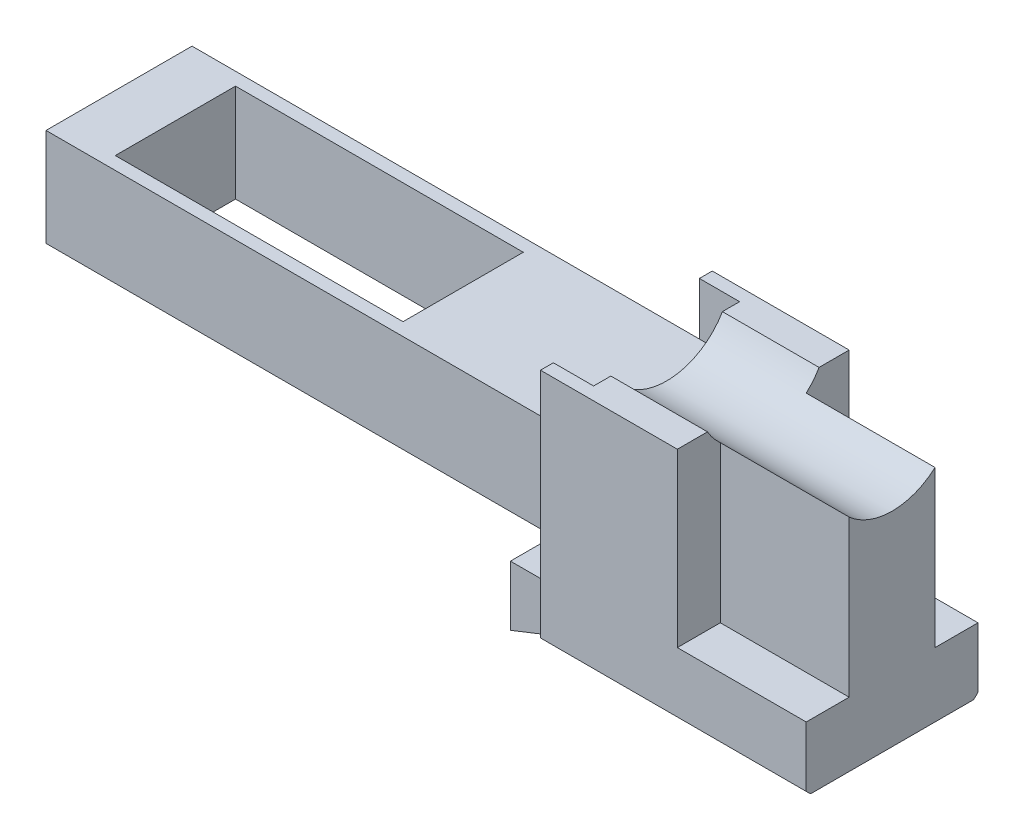
ISO-10303-21;
HEADER;
FILE_DESCRIPTION(('STEP AP214'),'2;1');
FILE_NAME('part.step','',(''),(''),'','','');
FILE_SCHEMA(('AUTOMOTIVE_DESIGN { 1 0 10303 214 1 1 1 1 }'));
ENDSEC;
DATA;
#1=APPLICATION_CONTEXT('core data for automotive mechanical design processes');
#2=APPLICATION_PROTOCOL_DEFINITION('international standard','automotive_design',2000,#1);
#3=PRODUCT_CONTEXT('',#1,'mechanical');
#4=PRODUCT('Part','Part','',(#3));
#5=PRODUCT_RELATED_PRODUCT_CATEGORY('part','',(#4));
#6=PRODUCT_DEFINITION_FORMATION('','',#4);
#7=PRODUCT_DEFINITION_CONTEXT('part definition',#1,'design');
#8=PRODUCT_DEFINITION('design','',#6,#7);
#9=PRODUCT_DEFINITION_SHAPE('','',#8);
#10=(LENGTH_UNIT() NAMED_UNIT(*) SI_UNIT(.MILLI.,.METRE.));
#11=(NAMED_UNIT(*) PLANE_ANGLE_UNIT() SI_UNIT($,.RADIAN.));
#12=(NAMED_UNIT(*) SI_UNIT($,.STERADIAN.) SOLID_ANGLE_UNIT());
#13=UNCERTAINTY_MEASURE_WITH_UNIT(LENGTH_MEASURE(1.E-05),#10,'distance_accuracy_value','');
#14=(GEOMETRIC_REPRESENTATION_CONTEXT(3) GLOBAL_UNCERTAINTY_ASSIGNED_CONTEXT((#13)) GLOBAL_UNIT_ASSIGNED_CONTEXT((#10,
#11,#12)) REPRESENTATION_CONTEXT('',''));
#15=CARTESIAN_POINT('',(0.,0.,0.));
#16=DIRECTION('',(0.,0.,1.));
#17=DIRECTION('',(1.,0.,0.));
#18=AXIS2_PLACEMENT_3D('',#15,#16,#17);
#19=CARTESIAN_POINT('',(0.,0.,-17.));
#20=DIRECTION('',(0.,1.,0.));
#21=DIRECTION('',(0.,0.,1.));
#22=AXIS2_PLACEMENT_3D('',#19,#20,#21);
#23=PLANE('',#22);
#24=DIRECTION('',(1.,0.,0.));
#25=VECTOR('',#24,1.);
#26=CARTESIAN_POINT('',(100.45836543402,0.,12.9903810567666));
#27=LINE('',#26,#25);
#28=CARTESIAN_POINT('',(127.5,0.,12.9903810567666));
#29=VERTEX_POINT('',#28);
#30=CARTESIAN_POINT('',(150.,0.,12.9903810567666));
#31=VERTEX_POINT('',#30);
#32=EDGE_CURVE('E245',#29,#31,#27,.T.);
#33=ORIENTED_EDGE('',*,*,#32,.F.);
#34=DIRECTION('',(0.,0.,1.));
#35=VECTOR('',#34,1.);
#36=CARTESIAN_POINT('',(127.5,0.,-17.));
#37=LINE('',#36,#35);
#38=CARTESIAN_POINT('',(127.5,0.,17.));
#39=VERTEX_POINT('',#38);
#40=EDGE_CURVE('E257',#29,#39,#37,.T.);
#41=ORIENTED_EDGE('',*,*,#40,.T.);
#42=DIRECTION('',(-1.,0.,0.));
#43=VECTOR('',#42,1.);
#44=CARTESIAN_POINT('',(0.,0.,17.));
#45=LINE('',#44,#43);
#46=CARTESIAN_POINT('',(118.13,0.,17.));
#47=VERTEX_POINT('',#46);
#48=EDGE_CURVE('E274',#39,#47,#45,.T.);
#49=ORIENTED_EDGE('',*,*,#48,.T.);
#50=DIRECTION('',(0.,0.,-1.));
#51=VECTOR('',#50,1.);
#52=CARTESIAN_POINT('',(118.13,0.,20.));
#53=LINE('',#52,#51);
#54=CARTESIAN_POINT('',(118.13,0.,20.));
#55=VERTEX_POINT('',#54);
#56=EDGE_CURVE('E293',#55,#47,#53,.T.);
#57=ORIENTED_EDGE('',*,*,#56,.F.);
#58=DIRECTION('',(1.,0.,0.));
#59=VECTOR('',#58,1.);
#60=CARTESIAN_POINT('',(0.,0.,20.));
#61=LINE('',#60,#59);
#62=CARTESIAN_POINT('',(150.,0.,20.));
#63=VERTEX_POINT('',#62);
#64=EDGE_CURVE('E285',#55,#63,#61,.T.);
#65=ORIENTED_EDGE('',*,*,#64,.T.);
#66=DIRECTION('',(0.,0.,1.));
#67=VECTOR('',#66,1.);
#68=CARTESIAN_POINT('',(150.,0.,10.));
#69=LINE('',#68,#67);
#70=EDGE_CURVE('E260',#31,#63,#69,.T.);
#71=ORIENTED_EDGE('',*,*,#70,.F.);
#72=EDGE_LOOP('',(#33,#41,#49,#57,#65,#71));
#73=FACE_BOUND('',#72,.T.);
#74=ADVANCED_FACE('F35',(#73),#23,.T.);
#75=CARTESIAN_POINT('',(0.,-35.,-17.));
#76=DIRECTION('',(0.,-1.,0.));
#77=DIRECTION('',(0.,0.,-1.));
#78=AXIS2_PLACEMENT_3D('',#75,#76,#77);
#79=PLANE('',#78);
#80=DIRECTION('',(1.,0.,0.));
#81=VECTOR('',#80,1.);
#82=CARTESIAN_POINT('',(0.,-35.,17.));
#83=LINE('',#82,#81);
#84=CARTESIAN_POINT('',(0.,-35.,17.));
#85=VERTEX_POINT('',#84);
#86=CARTESIAN_POINT('',(118.13,-35.,17.));
#87=VERTEX_POINT('',#86);
#88=EDGE_CURVE('E320',#85,#87,#83,.T.);
#89=ORIENTED_EDGE('',*,*,#88,.F.);
#90=DIRECTION('',(0.,0.,1.));
#91=VECTOR('',#90,1.);
#92=CARTESIAN_POINT('',(0.,-35.,-17.));
#93=LINE('',#92,#91);
#94=CARTESIAN_POINT('',(0.,-35.,-17.));
#95=VERTEX_POINT('',#94);
#96=EDGE_CURVE('E333',#95,#85,#93,.T.);
#97=ORIENTED_EDGE('',*,*,#96,.F.);
#98=DIRECTION('',(1.,0.,0.));
#99=VECTOR('',#98,1.);
#100=CARTESIAN_POINT('',(0.,-35.,-17.));
#101=LINE('',#100,#99);
#102=CARTESIAN_POINT('',(118.13,-35.,-17.));
#103=VERTEX_POINT('',#102);
#104=EDGE_CURVE('E304',#95,#103,#101,.T.);
#105=ORIENTED_EDGE('',*,*,#104,.T.);
#106=DIRECTION('',(0.,0.,1.));
#107=VECTOR('',#106,1.);
#108=CARTESIAN_POINT('',(118.13,-35.,-17.));
#109=LINE('',#108,#107);
#110=EDGE_CURVE('E319',#103,#87,#109,.T.);
#111=ORIENTED_EDGE('',*,*,#110,.T.);
#112=EDGE_LOOP('',(#89,#97,#105,#111));
#113=FACE_BOUND('',#112,.T.);
#114=DIRECTION('',(0.,0.,1.));
#115=VECTOR('',#114,1.);
#116=CARTESIAN_POINT('',(80.13,-35.,-14.));
#117=LINE('',#116,#115);
#118=CARTESIAN_POINT('',(80.13,-35.,-14.));
#119=VERTEX_POINT('',#118);
#120=CARTESIAN_POINT('',(80.13,-35.,14.));
#121=VERTEX_POINT('',#120);
#122=EDGE_CURVE('E713',#119,#121,#117,.T.);
#123=ORIENTED_EDGE('',*,*,#122,.F.);
#124=DIRECTION('',(1.,0.,0.));
#125=VECTOR('',#124,1.);
#126=CARTESIAN_POINT('',(0.,-35.,-14.));
#127=LINE('',#126,#125);
#128=CARTESIAN_POINT('',(13.13,-35.,-14.));
#129=VERTEX_POINT('',#128);
#130=EDGE_CURVE('E700',#129,#119,#127,.T.);
#131=ORIENTED_EDGE('',*,*,#130,.F.);
#132=DIRECTION('',(0.,0.,1.));
#133=VECTOR('',#132,1.);
#134=CARTESIAN_POINT('',(13.13,-35.,-14.));
#135=LINE('',#134,#133);
#136=CARTESIAN_POINT('',(13.13,-35.,14.));
#137=VERTEX_POINT('',#136);
#138=EDGE_CURVE('E403',#129,#137,#135,.T.);
#139=ORIENTED_EDGE('',*,*,#138,.T.);
#140=DIRECTION('',(1.,0.,0.));
#141=VECTOR('',#140,1.);
#142=CARTESIAN_POINT('',(0.,-35.,14.));
#143=LINE('',#142,#141);
#144=EDGE_CURVE('E695',#137,#121,#143,.T.);
#145=ORIENTED_EDGE('',*,*,#144,.T.);
#146=EDGE_LOOP('',(#123,#131,#139,#145));
#147=FACE_BOUND('',#146,.T.);
#148=ADVANCED_FACE('F475',(#113,#147),#79,.T.);
#149=CARTESIAN_POINT('',(0.,-12.22,-17.));
#150=DIRECTION('',(0.,-1.,0.));
#151=DIRECTION('',(0.,0.,-1.));
#152=AXIS2_PLACEMENT_3D('',#149,#150,#151);
#153=PLANE('',#152);
#154=DIRECTION('',(1.,0.,0.));
#155=VECTOR('',#154,1.);
#156=CARTESIAN_POINT('',(0.,-12.22,17.));
#157=LINE('',#156,#155);
#158=CARTESIAN_POINT('',(0.,-12.22,17.));
#159=VERTEX_POINT('',#158);
#160=CARTESIAN_POINT('',(118.13,-12.22,17.));
#161=VERTEX_POINT('',#160);
#162=EDGE_CURVE('E446',#159,#161,#157,.T.);
#163=ORIENTED_EDGE('',*,*,#162,.T.);
#164=CARTESIAN_POINT('',(127.5,-12.22,17.));
#165=VERTEX_POINT('',#164);
#166=EDGE_CURVE('E437',#161,#165,#157,.T.);
#167=ORIENTED_EDGE('',*,*,#166,.T.);
#168=DIRECTION('',(0.,0.,1.));
#169=VECTOR('',#168,1.);
#170=CARTESIAN_POINT('',(127.5,-12.22,-17.));
#171=LINE('',#170,#169);
#172=CARTESIAN_POINT('',(127.5,-12.22,-17.));
#173=VERTEX_POINT('',#172);
#174=EDGE_CURVE('E268',#173,#165,#171,.T.);
#175=ORIENTED_EDGE('',*,*,#174,.F.);
#176=DIRECTION('',(1.,0.,0.));
#177=VECTOR('',#176,1.);
#178=CARTESIAN_POINT('',(0.,-12.22,-17.));
#179=LINE('',#178,#177);
#180=CARTESIAN_POINT('',(118.13,-12.22,-17.));
#181=VERTEX_POINT('',#180);
#182=EDGE_CURVE('E442',#181,#173,#179,.T.);
#183=ORIENTED_EDGE('',*,*,#182,.F.);
#184=CARTESIAN_POINT('',(0.,-12.22,-17.));
#185=VERTEX_POINT('',#184);
#186=EDGE_CURVE('E438',#185,#181,#179,.T.);
#187=ORIENTED_EDGE('',*,*,#186,.F.);
#188=DIRECTION('',(0.,0.,1.));
#189=VECTOR('',#188,1.);
#190=CARTESIAN_POINT('',(0.,-12.22,-17.));
#191=LINE('',#190,#189);
#192=EDGE_CURVE('E271',#185,#159,#191,.T.);
#193=ORIENTED_EDGE('',*,*,#192,.T.);
#194=EDGE_LOOP('',(#163,#167,#175,#183,#187,#193));
#195=FACE_BOUND('',#194,.T.);
#196=DIRECTION('',(1.,0.,0.));
#197=VECTOR('',#196,1.);
#198=CARTESIAN_POINT('',(0.,-12.22,-14.));
#199=LINE('',#198,#197);
#200=CARTESIAN_POINT('',(13.13,-12.22,-14.));
#201=VERTEX_POINT('',#200);
#202=CARTESIAN_POINT('',(80.13,-12.22,-14.));
#203=VERTEX_POINT('',#202);
#204=EDGE_CURVE('E707',#201,#203,#199,.T.);
#205=ORIENTED_EDGE('',*,*,#204,.T.);
#206=DIRECTION('',(0.,0.,1.));
#207=VECTOR('',#206,1.);
#208=CARTESIAN_POINT('',(80.13,-12.22,-14.));
#209=LINE('',#208,#207);
#210=CARTESIAN_POINT('',(80.13,-12.22,14.));
#211=VERTEX_POINT('',#210);
#212=EDGE_CURVE('E725',#203,#211,#209,.T.);
#213=ORIENTED_EDGE('',*,*,#212,.T.);
#214=DIRECTION('',(1.,0.,0.));
#215=VECTOR('',#214,1.);
#216=CARTESIAN_POINT('',(0.,-12.22,14.));
#217=LINE('',#216,#215);
#218=CARTESIAN_POINT('',(13.13,-12.22,14.));
#219=VERTEX_POINT('',#218);
#220=EDGE_CURVE('E719',#219,#211,#217,.T.);
#221=ORIENTED_EDGE('',*,*,#220,.F.);
#222=DIRECTION('',(0.,0.,1.));
#223=VECTOR('',#222,1.);
#224=CARTESIAN_POINT('',(13.13,-12.22,-14.));
#225=LINE('',#224,#223);
#226=EDGE_CURVE('E408',#201,#219,#225,.T.);
#227=ORIENTED_EDGE('',*,*,#226,.F.);
#228=EDGE_LOOP('',(#205,#213,#221,#227));
#229=FACE_BOUND('',#228,.T.);
#230=ADVANCED_FACE('F455',(#195,#229),#153,.F.);
#231=DIRECTION('',(1.,0.,0.));
#232=VECTOR('',#231,1.);
#233=CARTESIAN_POINT('',(100.45836543402,0.,-12.9903810567666));
#234=LINE('',#233,#232);
#235=CARTESIAN_POINT('',(127.5,0.,-12.9903810567666));
#236=VERTEX_POINT('',#235);
#237=CARTESIAN_POINT('',(150.,0.,-12.9903810567666));
#238=VERTEX_POINT('',#237);
#239=EDGE_CURVE('E248',#236,#238,#234,.T.);
#240=ORIENTED_EDGE('',*,*,#239,.T.);
#241=DIRECTION('',(0.,0.,-1.));
#242=VECTOR('',#241,1.);
#243=CARTESIAN_POINT('',(150.,0.,-10.));
#244=LINE('',#243,#242);
#245=CARTESIAN_POINT('',(150.,0.,-20.));
#246=VERTEX_POINT('',#245);
#247=EDGE_CURVE('E414',#238,#246,#244,.T.);
#248=ORIENTED_EDGE('',*,*,#247,.T.);
#249=DIRECTION('',(1.,0.,0.));
#250=VECTOR('',#249,1.);
#251=CARTESIAN_POINT('',(0.,0.,-20.));
#252=LINE('',#251,#250);
#253=CARTESIAN_POINT('',(118.13,0.,-20.));
#254=VERTEX_POINT('',#253);
#255=EDGE_CURVE('E282',#254,#246,#252,.T.);
#256=ORIENTED_EDGE('',*,*,#255,.F.);
#257=CARTESIAN_POINT('',(118.13,0.,-17.));
#258=VERTEX_POINT('',#257);
#259=EDGE_CURVE('E287',#258,#254,#53,.T.);
#260=ORIENTED_EDGE('',*,*,#259,.F.);
#261=DIRECTION('',(-1.,0.,0.));
#262=VECTOR('',#261,1.);
#263=CARTESIAN_POINT('',(0.,0.,-17.));
#264=LINE('',#263,#262);
#265=CARTESIAN_POINT('',(127.5,0.,-17.));
#266=VERTEX_POINT('',#265);
#267=EDGE_CURVE('E278',#266,#258,#264,.T.);
#268=ORIENTED_EDGE('',*,*,#267,.F.);
#269=EDGE_CURVE('E267',#266,#236,#37,.T.);
#270=ORIENTED_EDGE('',*,*,#269,.T.);
#271=EDGE_LOOP('',(#240,#248,#256,#260,#268,#270));
#272=FACE_BOUND('',#271,.T.);
#273=ADVANCED_FACE('F459',(#272),#23,.T.);
#274=CARTESIAN_POINT('',(0.,0.,-17.));
#275=DIRECTION('',(0.,0.,1.));
#276=DIRECTION('',(1.,0.,0.));
#277=AXIS2_PLACEMENT_3D('',#274,#275,#276);
#278=PLANE('',#277);
#279=DIRECTION('',(0.,-1.,0.));
#280=VECTOR('',#279,1.);
#281=CARTESIAN_POINT('',(0.,0.,-17.));
#282=LINE('',#281,#280);
#283=EDGE_CURVE('E317',#185,#95,#282,.T.);
#284=ORIENTED_EDGE('',*,*,#283,.F.);
#285=ORIENTED_EDGE('',*,*,#186,.T.);
#286=DIRECTION('',(0.,-1.,0.));
#287=VECTOR('',#286,1.);
#288=CARTESIAN_POINT('',(118.13,0.,-17.));
#289=LINE('',#288,#287);
#290=EDGE_CURVE('E302',#181,#103,#289,.T.);
#291=ORIENTED_EDGE('',*,*,#290,.T.);
#292=ORIENTED_EDGE('',*,*,#104,.F.);
#293=EDGE_LOOP('',(#284,#285,#291,#292));
#294=FACE_BOUND('',#293,.T.);
#295=ADVANCED_FACE('F469',(#294),#278,.F.);
#296=CARTESIAN_POINT('',(0.,0.,17.));
#297=DIRECTION('',(0.,0.,1.));
#298=DIRECTION('',(1.,0.,0.));
#299=AXIS2_PLACEMENT_3D('',#296,#297,#298);
#300=PLANE('',#299);
#301=ORIENTED_EDGE('',*,*,#162,.F.);
#302=DIRECTION('',(0.,-1.,0.));
#303=VECTOR('',#302,1.);
#304=CARTESIAN_POINT('',(0.,0.,17.));
#305=LINE('',#304,#303);
#306=EDGE_CURVE('E308',#159,#85,#305,.T.);
#307=ORIENTED_EDGE('',*,*,#306,.T.);
#308=ORIENTED_EDGE('',*,*,#88,.T.);
#309=DIRECTION('',(0.,-1.,0.));
#310=VECTOR('',#309,1.);
#311=CARTESIAN_POINT('',(118.13,0.,17.));
#312=LINE('',#311,#310);
#313=EDGE_CURVE('E354',#161,#87,#312,.T.);
#314=ORIENTED_EDGE('',*,*,#313,.F.);
#315=EDGE_LOOP('',(#301,#307,#308,#314));
#316=FACE_BOUND('',#315,.T.);
#317=ADVANCED_FACE('F483',(#316),#300,.T.);
#318=CARTESIAN_POINT('',(0.,0.,-17.));
#319=DIRECTION('',(-1.,0.,0.));
#320=DIRECTION('',(0.,0.,1.));
#321=AXIS2_PLACEMENT_3D('',#318,#319,#320);
#322=PLANE('',#321);
#323=ORIENTED_EDGE('',*,*,#192,.F.);
#324=ORIENTED_EDGE('',*,*,#283,.T.);
#325=ORIENTED_EDGE('',*,*,#96,.T.);
#326=ORIENTED_EDGE('',*,*,#306,.F.);
#327=EDGE_LOOP('',(#323,#324,#325,#326));
#328=FACE_BOUND('',#327,.T.);
#329=ADVANCED_FACE('F480',(#328),#322,.T.);
#330=CARTESIAN_POINT('',(180.,0.,-17.));
#331=DIRECTION('',(-1.,0.,0.));
#332=DIRECTION('',(0.,0.,1.));
#333=AXIS2_PLACEMENT_3D('',#330,#331,#332);
#334=PLANE('',#333);
#335=DIRECTION('',(0.,-1.,0.));
#336=VECTOR('',#335,1.);
#337=CARTESIAN_POINT('',(180.,0.,20.));
#338=LINE('',#337,#336);
#339=CARTESIAN_POINT('',(180.,-40.,20.));
#340=VERTEX_POINT('',#339);
#341=CARTESIAN_POINT('',(180.,-54.,20.));
#342=VERTEX_POINT('',#341);
#343=EDGE_CURVE('E281',#340,#342,#338,.T.);
#344=ORIENTED_EDGE('',*,*,#343,.T.);
#345=DIRECTION('',(0.,0.707106781186549,0.707106781186546));
#346=VECTOR('',#345,1.);
#347=CARTESIAN_POINT('',(180.,-54.,20.));
#348=LINE('',#347,#346);
#349=CARTESIAN_POINT('',(180.,-55.,19.));
#350=VERTEX_POINT('',#349);
#351=EDGE_CURVE('E363',#342,#350,#348,.F.);
#352=ORIENTED_EDGE('',*,*,#351,.T.);
#353=DIRECTION('',(0.,0.,1.));
#354=VECTOR('',#353,1.);
#355=CARTESIAN_POINT('',(180.,-55.,-17.));
#356=LINE('',#355,#354);
#357=CARTESIAN_POINT('',(180.,-55.,-19.));
#358=VERTEX_POINT('',#357);
#359=EDGE_CURVE('E337',#358,#350,#356,.T.);
#360=ORIENTED_EDGE('',*,*,#359,.F.);
#361=DIRECTION('',(0.,0.707106781186548,-0.707106781186548));
#362=VECTOR('',#361,1.);
#363=CARTESIAN_POINT('',(180.,-55.,-19.));
#364=LINE('',#363,#362);
#365=CARTESIAN_POINT('',(180.,-54.,-20.));
#366=VERTEX_POINT('',#365);
#367=EDGE_CURVE('E361',#358,#366,#364,.T.);
#368=ORIENTED_EDGE('',*,*,#367,.T.);
#369=DIRECTION('',(0.,-1.,0.));
#370=VECTOR('',#369,1.);
#371=CARTESIAN_POINT('',(180.,0.,-20.));
#372=LINE('',#371,#370);
#373=CARTESIAN_POINT('',(180.,-40.,-20.));
#374=VERTEX_POINT('',#373);
#375=EDGE_CURVE('E289',#374,#366,#372,.T.);
#376=ORIENTED_EDGE('',*,*,#375,.F.);
#377=DIRECTION('',(0.,0.,-1.));
#378=VECTOR('',#377,1.);
#379=CARTESIAN_POINT('',(180.,-40.,-10.));
#380=LINE('',#379,#378);
#381=CARTESIAN_POINT('',(180.,-40.,-10.));
#382=VERTEX_POINT('',#381);
#383=EDGE_CURVE('E419',#382,#374,#380,.T.);
#384=ORIENTED_EDGE('',*,*,#383,.F.);
#385=DIRECTION('',(0.,-1.,0.));
#386=VECTOR('',#385,1.);
#387=CARTESIAN_POINT('',(180.,0.,-10.));
#388=LINE('',#387,#386);
#389=CARTESIAN_POINT('',(180.,-3.68033988749895,-10.));
#390=VERTEX_POINT('',#389);
#391=EDGE_CURVE('E405',#390,#382,#388,.T.);
#392=ORIENTED_EDGE('',*,*,#391,.F.);
#393=CARTESIAN_POINT('',(180.,7.5,0.));
#394=DIRECTION('',(1.,0.,0.));
#395=DIRECTION('',(0.,0.,1.));
#396=AXIS2_PLACEMENT_3D('',#393,#394,#395);
#397=CIRCLE('',#396,15.);
#398=CARTESIAN_POINT('',(180.,-3.68033988749895,10.));
#399=VERTEX_POINT('',#398);
#400=EDGE_CURVE('E664',#399,#390,#397,.T.);
#401=ORIENTED_EDGE('',*,*,#400,.F.);
#402=DIRECTION('',(0.,-1.,0.));
#403=VECTOR('',#402,1.);
#404=CARTESIAN_POINT('',(180.,0.,10.));
#405=LINE('',#404,#403);
#406=CARTESIAN_POINT('',(180.,-40.,10.));
#407=VERTEX_POINT('',#406);
#408=EDGE_CURVE('E421',#399,#407,#405,.T.);
#409=ORIENTED_EDGE('',*,*,#408,.T.);
#410=DIRECTION('',(0.,0.,1.));
#411=VECTOR('',#410,1.);
#412=CARTESIAN_POINT('',(180.,-40.,10.));
#413=LINE('',#412,#411);
#414=EDGE_CURVE('E435',#407,#340,#413,.T.);
#415=ORIENTED_EDGE('',*,*,#414,.T.);
#416=EDGE_LOOP('',(#344,#352,#360,#368,#376,#384,#392,#401,#409,#415));
#417=FACE_BOUND('',#416,.T.);
#418=ADVANCED_FACE('F386',(#417),#334,.F.);
#419=CARTESIAN_POINT('',(0.,-55.,-17.));
#420=DIRECTION('',(0.,-1.,0.));
#421=DIRECTION('',(0.,0.,-1.));
#422=AXIS2_PLACEMENT_3D('',#419,#420,#421);
#423=PLANE('',#422);
#424=ORIENTED_EDGE('',*,*,#359,.T.);
#425=DIRECTION('',(-1.,0.,0.));
#426=VECTOR('',#425,1.);
#427=CARTESIAN_POINT('',(0.,-55.,19.));
#428=LINE('',#427,#426);
#429=CARTESIAN_POINT('',(118.13,-55.,19.));
#430=VERTEX_POINT('',#429);
#431=EDGE_CURVE('E368',#350,#430,#428,.T.);
#432=ORIENTED_EDGE('',*,*,#431,.T.);
#433=DIRECTION('',(0.,0.,-1.));
#434=VECTOR('',#433,1.);
#435=CARTESIAN_POINT('',(118.13,-55.,20.));
#436=LINE('',#435,#434);
#437=CARTESIAN_POINT('',(118.13,-55.,17.));
#438=VERTEX_POINT('',#437);
#439=EDGE_CURVE('E297',#430,#438,#436,.T.);
#440=ORIENTED_EDGE('',*,*,#439,.T.);
#441=DIRECTION('',(0.,0.,1.));
#442=VECTOR('',#441,1.);
#443=CARTESIAN_POINT('',(118.13,-55.,-17.));
#444=LINE('',#443,#442);
#445=CARTESIAN_POINT('',(118.13,-55.,-17.));
#446=VERTEX_POINT('',#445);
#447=EDGE_CURVE('E340',#446,#438,#444,.T.);
#448=ORIENTED_EDGE('',*,*,#447,.F.);
#449=CARTESIAN_POINT('',(118.13,-55.,-19.));
#450=VERTEX_POINT('',#449);
#451=EDGE_CURVE('E296',#446,#450,#436,.T.);
#452=ORIENTED_EDGE('',*,*,#451,.T.);
#453=DIRECTION('',(1.,0.,0.));
#454=VECTOR('',#453,1.);
#455=CARTESIAN_POINT('',(180.,-55.,-19.));
#456=LINE('',#455,#454);
#457=EDGE_CURVE('E365',#450,#358,#456,.T.);
#458=ORIENTED_EDGE('',*,*,#457,.T.);
#459=EDGE_LOOP('',(#424,#432,#440,#448,#452,#458));
#460=FACE_BOUND('',#459,.T.);
#461=ADVANCED_FACE('F389',(#460),#423,.T.);
#462=CARTESIAN_POINT('',(34.7364747734694,-87.9404424644796,-17.));
#463=DIRECTION('',(0.367378285083804,-0.9300716078071,0.));
#464=DIRECTION('',(0.9300716078071,0.367378285083804,0.));
#465=AXIS2_PLACEMENT_3D('',#462,#463,#464);
#466=PLANE('',#465);
#467=DIRECTION('',(0.9300716078071,0.367378285083804,0.));
#468=VECTOR('',#467,1.);
#469=CARTESIAN_POINT('',(34.7364747734694,-87.9404424644796,17.));
#470=LINE('',#469,#468);
#471=CARTESIAN_POINT('',(108.13,-58.95,17.));
#472=VERTEX_POINT('',#471);
#473=EDGE_CURVE('E329',#472,#438,#470,.T.);
#474=ORIENTED_EDGE('',*,*,#473,.F.);
#475=DIRECTION('',(0.,0.,1.));
#476=VECTOR('',#475,1.);
#477=CARTESIAN_POINT('',(108.13,-58.95,-17.));
#478=LINE('',#477,#476);
#479=CARTESIAN_POINT('',(108.13,-58.95,-17.));
#480=VERTEX_POINT('',#479);
#481=EDGE_CURVE('E343',#480,#472,#478,.T.);
#482=ORIENTED_EDGE('',*,*,#481,.F.);
#483=DIRECTION('',(0.9300716078071,0.367378285083804,0.));
#484=VECTOR('',#483,1.);
#485=CARTESIAN_POINT('',(34.7364747734694,-87.9404424644796,-17.));
#486=LINE('',#485,#484);
#487=EDGE_CURVE('E314',#480,#446,#486,.T.);
#488=ORIENTED_EDGE('',*,*,#487,.T.);
#489=ORIENTED_EDGE('',*,*,#447,.T.);
#490=EDGE_LOOP('',(#474,#482,#488,#489));
#491=FACE_BOUND('',#490,.T.);
#492=ADVANCED_FACE('F572',(#491),#466,.T.);
#493=CARTESIAN_POINT('',(108.13,0.,-17.));
#494=DIRECTION('',(-1.,0.,0.));
#495=DIRECTION('',(0.,0.,1.));
#496=AXIS2_PLACEMENT_3D('',#493,#494,#495);
#497=PLANE('',#496);
#498=DIRECTION('',(0.,-1.,0.));
#499=VECTOR('',#498,1.);
#500=CARTESIAN_POINT('',(108.13,0.,17.));
#501=LINE('',#500,#499);
#502=CARTESIAN_POINT('',(108.13,-45.,17.));
#503=VERTEX_POINT('',#502);
#504=EDGE_CURVE('E326',#503,#472,#501,.T.);
#505=ORIENTED_EDGE('',*,*,#504,.F.);
#506=DIRECTION('',(0.,0.,1.));
#507=VECTOR('',#506,1.);
#508=CARTESIAN_POINT('',(108.13,-45.,-17.));
#509=LINE('',#508,#507);
#510=CARTESIAN_POINT('',(108.13,-45.,-17.));
#511=VERTEX_POINT('',#510);
#512=EDGE_CURVE('E345',#511,#503,#509,.T.);
#513=ORIENTED_EDGE('',*,*,#512,.F.);
#514=DIRECTION('',(0.,-1.,0.));
#515=VECTOR('',#514,1.);
#516=CARTESIAN_POINT('',(108.13,0.,-17.));
#517=LINE('',#516,#515);
#518=EDGE_CURVE('E311',#511,#480,#517,.T.);
#519=ORIENTED_EDGE('',*,*,#518,.T.);
#520=ORIENTED_EDGE('',*,*,#481,.T.);
#521=EDGE_LOOP('',(#505,#513,#519,#520));
#522=FACE_BOUND('',#521,.T.);
#523=ADVANCED_FACE('F563',(#522),#497,.T.);
#524=CARTESIAN_POINT('',(0.,-45.,-17.));
#525=DIRECTION('',(0.,-1.,0.));
#526=DIRECTION('',(0.,0.,-1.));
#527=AXIS2_PLACEMENT_3D('',#524,#525,#526);
#528=PLANE('',#527);
#529=DIRECTION('',(1.,0.,0.));
#530=VECTOR('',#529,1.);
#531=CARTESIAN_POINT('',(0.,-45.,17.));
#532=LINE('',#531,#530);
#533=CARTESIAN_POINT('',(118.13,-45.,17.));
#534=VERTEX_POINT('',#533);
#535=EDGE_CURVE('E323',#503,#534,#532,.T.);
#536=ORIENTED_EDGE('',*,*,#535,.T.);
#537=DIRECTION('',(0.,0.,1.));
#538=VECTOR('',#537,1.);
#539=CARTESIAN_POINT('',(118.13,-45.,-17.));
#540=LINE('',#539,#538);
#541=CARTESIAN_POINT('',(118.13,-45.,-17.));
#542=VERTEX_POINT('',#541);
#543=EDGE_CURVE('E347',#542,#534,#540,.T.);
#544=ORIENTED_EDGE('',*,*,#543,.F.);
#545=DIRECTION('',(1.,0.,0.));
#546=VECTOR('',#545,1.);
#547=CARTESIAN_POINT('',(0.,-45.,-17.));
#548=LINE('',#547,#546);
#549=EDGE_CURVE('E307',#511,#542,#548,.T.);
#550=ORIENTED_EDGE('',*,*,#549,.F.);
#551=ORIENTED_EDGE('',*,*,#512,.T.);
#552=EDGE_LOOP('',(#536,#544,#550,#551));
#553=FACE_BOUND('',#552,.T.);
#554=ADVANCED_FACE('F558',(#553),#528,.F.);
#555=CARTESIAN_POINT('',(118.13,0.,-17.));
#556=DIRECTION('',(1.,0.,0.));
#557=DIRECTION('',(0.,0.,-1.));
#558=AXIS2_PLACEMENT_3D('',#555,#556,#557);
#559=PLANE('',#558);
#560=ORIENTED_EDGE('',*,*,#439,.F.);
#561=DIRECTION('',(0.,-0.707106781186549,-0.707106781186546));
#562=VECTOR('',#561,1.);
#563=CARTESIAN_POINT('',(118.13,-54.,20.));
#564=LINE('',#563,#562);
#565=CARTESIAN_POINT('',(118.13,-54.,20.));
#566=VERTEX_POINT('',#565);
#567=EDGE_CURVE('E43',#430,#566,#564,.F.);
#568=ORIENTED_EDGE('',*,*,#567,.T.);
#569=DIRECTION('',(0.,1.,0.));
#570=VECTOR('',#569,1.);
#571=CARTESIAN_POINT('',(118.13,0.,20.));
#572=LINE('',#571,#570);
#573=EDGE_CURVE('E279',#566,#55,#572,.T.);
#574=ORIENTED_EDGE('',*,*,#573,.T.);
#575=ORIENTED_EDGE('',*,*,#56,.T.);
#576=EDGE_CURVE('E355',#47,#161,#312,.T.);
#577=ORIENTED_EDGE('',*,*,#576,.T.);
#578=ORIENTED_EDGE('',*,*,#313,.T.);
#579=ORIENTED_EDGE('',*,*,#110,.F.);
#580=ORIENTED_EDGE('',*,*,#290,.F.);
#581=EDGE_CURVE('E303',#258,#181,#289,.T.);
#582=ORIENTED_EDGE('',*,*,#581,.F.);
#583=ORIENTED_EDGE('',*,*,#259,.T.);
#584=DIRECTION('',(0.,1.,0.));
#585=VECTOR('',#584,1.);
#586=CARTESIAN_POINT('',(118.13,0.,-20.));
#587=LINE('',#586,#585);
#588=CARTESIAN_POINT('',(118.13,-54.,-20.));
#589=VERTEX_POINT('',#588);
#590=EDGE_CURVE('E270',#589,#254,#587,.T.);
#591=ORIENTED_EDGE('',*,*,#590,.F.);
#592=DIRECTION('',(0.,-0.707106781186548,0.707106781186548));
#593=VECTOR('',#592,1.);
#594=CARTESIAN_POINT('',(118.13,-55.,-19.));
#595=LINE('',#594,#593);
#596=EDGE_CURVE('E55',#589,#450,#595,.T.);
#597=ORIENTED_EDGE('',*,*,#596,.T.);
#598=ORIENTED_EDGE('',*,*,#451,.F.);
#599=EDGE_CURVE('E299',#542,#446,#289,.T.);
#600=ORIENTED_EDGE('',*,*,#599,.F.);
#601=ORIENTED_EDGE('',*,*,#543,.T.);
#602=EDGE_CURVE('E336',#534,#438,#312,.T.);
#603=ORIENTED_EDGE('',*,*,#602,.T.);
#604=EDGE_LOOP('',(#560,#568,#574,#575,#577,#578,#579,#580,#582,#583,#591,#597,#598,#600,#601,#603));
#605=FACE_BOUND('',#604,.T.);
#606=ADVANCED_FACE('F373',(#605),#559,.F.);
#607=ORIENTED_EDGE('',*,*,#549,.T.);
#608=ORIENTED_EDGE('',*,*,#599,.T.);
#609=ORIENTED_EDGE('',*,*,#487,.F.);
#610=ORIENTED_EDGE('',*,*,#518,.F.);
#611=EDGE_LOOP('',(#607,#608,#609,#610));
#612=FACE_BOUND('',#611,.T.);
#613=ADVANCED_FACE('F509',(#612),#278,.F.);
#614=ORIENTED_EDGE('',*,*,#602,.F.);
#615=ORIENTED_EDGE('',*,*,#535,.F.);
#616=ORIENTED_EDGE('',*,*,#504,.T.);
#617=ORIENTED_EDGE('',*,*,#473,.T.);
#618=EDGE_LOOP('',(#614,#615,#616,#617));
#619=FACE_BOUND('',#618,.T.);
#620=ADVANCED_FACE('F516',(#619),#300,.T.);
#621=CARTESIAN_POINT('',(0.,0.,20.));
#622=DIRECTION('',(0.,0.,1.));
#623=DIRECTION('',(1.,0.,0.));
#624=AXIS2_PLACEMENT_3D('',#621,#622,#623);
#625=PLANE('',#624);
#626=ORIENTED_EDGE('',*,*,#573,.F.);
#627=DIRECTION('',(1.,0.,0.));
#628=VECTOR('',#627,1.);
#629=CARTESIAN_POINT('',(0.,-54.,20.));
#630=LINE('',#629,#628);
#631=EDGE_CURVE('E358',#566,#342,#630,.T.);
#632=ORIENTED_EDGE('',*,*,#631,.T.);
#633=ORIENTED_EDGE('',*,*,#343,.F.);
#634=DIRECTION('',(1.,0.,0.));
#635=VECTOR('',#634,1.);
#636=CARTESIAN_POINT('',(150.,-40.,20.));
#637=LINE('',#636,#635);
#638=CARTESIAN_POINT('',(150.,-40.,20.));
#639=VERTEX_POINT('',#638);
#640=EDGE_CURVE('E416',#639,#340,#637,.T.);
#641=ORIENTED_EDGE('',*,*,#640,.F.);
#642=DIRECTION('',(0.,-1.,0.));
#643=VECTOR('',#642,1.);
#644=CARTESIAN_POINT('',(150.,0.,20.));
#645=LINE('',#644,#643);
#646=EDGE_CURVE('E424',#63,#639,#645,.T.);
#647=ORIENTED_EDGE('',*,*,#646,.F.);
#648=ORIENTED_EDGE('',*,*,#64,.F.);
#649=EDGE_LOOP('',(#626,#632,#633,#641,#647,#648));
#650=FACE_BOUND('',#649,.T.);
#651=ADVANCED_FACE('F380',(#650),#625,.T.);
#652=CARTESIAN_POINT('',(0.,0.,-20.));
#653=DIRECTION('',(0.,0.,1.));
#654=DIRECTION('',(1.,0.,0.));
#655=AXIS2_PLACEMENT_3D('',#652,#653,#654);
#656=PLANE('',#655);
#657=ORIENTED_EDGE('',*,*,#375,.T.);
#658=DIRECTION('',(-1.,0.,0.));
#659=VECTOR('',#658,1.);
#660=CARTESIAN_POINT('',(118.13,-54.,-20.));
#661=LINE('',#660,#659);
#662=EDGE_CURVE('E11',#366,#589,#661,.T.);
#663=ORIENTED_EDGE('',*,*,#662,.T.);
#664=ORIENTED_EDGE('',*,*,#590,.T.);
#665=ORIENTED_EDGE('',*,*,#255,.T.);
#666=DIRECTION('',(0.,1.,0.));
#667=VECTOR('',#666,1.);
#668=CARTESIAN_POINT('',(150.,0.,-20.));
#669=LINE('',#668,#667);
#670=CARTESIAN_POINT('',(150.,-40.,-20.));
#671=VERTEX_POINT('',#670);
#672=EDGE_CURVE('E401',#671,#246,#669,.T.);
#673=ORIENTED_EDGE('',*,*,#672,.F.);
#674=DIRECTION('',(-1.,0.,0.));
#675=VECTOR('',#674,1.);
#676=CARTESIAN_POINT('',(180.,-40.,-20.));
#677=LINE('',#676,#675);
#678=EDGE_CURVE('E399',#374,#671,#677,.T.);
#679=ORIENTED_EDGE('',*,*,#678,.F.);
#680=EDGE_LOOP('',(#657,#663,#664,#665,#673,#679));
#681=FACE_BOUND('',#680,.T.);
#682=ADVANCED_FACE('F396',(#681),#656,.F.);
#683=CARTESIAN_POINT('',(0.,0.,-17.));
#684=DIRECTION('',(0.,0.,1.));
#685=DIRECTION('',(1.,0.,0.));
#686=AXIS2_PLACEMENT_3D('',#683,#684,#685);
#687=PLANE('',#686);
#688=ORIENTED_EDGE('',*,*,#581,.T.);
#689=ORIENTED_EDGE('',*,*,#182,.T.);
#690=DIRECTION('',(0.,1.,0.));
#691=VECTOR('',#690,1.);
#692=CARTESIAN_POINT('',(127.5,0.,-17.));
#693=LINE('',#692,#691);
#694=EDGE_CURVE('E441',#173,#266,#693,.T.);
#695=ORIENTED_EDGE('',*,*,#694,.T.);
#696=ORIENTED_EDGE('',*,*,#267,.T.);
#697=EDGE_LOOP('',(#688,#689,#695,#696));
#698=FACE_BOUND('',#697,.T.);
#699=ADVANCED_FACE('F450',(#698),#687,.T.);
#700=CARTESIAN_POINT('',(0.,0.,17.));
#701=DIRECTION('',(0.,0.,1.));
#702=DIRECTION('',(1.,0.,0.));
#703=AXIS2_PLACEMENT_3D('',#700,#701,#702);
#704=PLANE('',#703);
#705=ORIENTED_EDGE('',*,*,#48,.F.);
#706=DIRECTION('',(0.,1.,0.));
#707=VECTOR('',#706,1.);
#708=CARTESIAN_POINT('',(127.5,0.,17.));
#709=LINE('',#708,#707);
#710=EDGE_CURVE('E265',#165,#39,#709,.T.);
#711=ORIENTED_EDGE('',*,*,#710,.F.);
#712=ORIENTED_EDGE('',*,*,#166,.F.);
#713=ORIENTED_EDGE('',*,*,#576,.F.);
#714=EDGE_LOOP('',(#705,#711,#712,#713));
#715=FACE_BOUND('',#714,.T.);
#716=ADVANCED_FACE('F485',(#715),#704,.F.);
#717=CARTESIAN_POINT('',(127.5,0.,-17.));
#718=DIRECTION('',(1.,0.,0.));
#719=DIRECTION('',(0.,0.,-1.));
#720=AXIS2_PLACEMENT_3D('',#717,#718,#719);
#721=PLANE('',#720);
#722=ORIENTED_EDGE('',*,*,#40,.F.);
#723=CARTESIAN_POINT('',(127.5,7.5,0.));
#724=DIRECTION('',(1.,0.,0.));
#725=DIRECTION('',(0.,0.,-1.));
#726=AXIS2_PLACEMENT_3D('',#723,#724,#725);
#727=CIRCLE('',#726,15.);
#728=EDGE_CURVE('E242',#236,#29,#727,.F.);
#729=ORIENTED_EDGE('',*,*,#728,.F.);
#730=ORIENTED_EDGE('',*,*,#269,.F.);
#731=ORIENTED_EDGE('',*,*,#694,.F.);
#732=ORIENTED_EDGE('',*,*,#174,.T.);
#733=ORIENTED_EDGE('',*,*,#710,.T.);
#734=EDGE_LOOP('',(#722,#729,#730,#731,#732,#733));
#735=FACE_BOUND('',#734,.T.);
#736=ADVANCED_FACE('F262',(#735),#721,.F.);
#737=CARTESIAN_POINT('',(150.,-40.,10.));
#738=DIRECTION('',(0.,-1.,0.));
#739=DIRECTION('',(0.,0.,-1.));
#740=AXIS2_PLACEMENT_3D('',#737,#738,#739);
#741=PLANE('',#740);
#742=ORIENTED_EDGE('',*,*,#640,.T.);
#743=ORIENTED_EDGE('',*,*,#414,.F.);
#744=DIRECTION('',(1.,0.,0.));
#745=VECTOR('',#744,1.);
#746=CARTESIAN_POINT('',(150.,-40.,10.));
#747=LINE('',#746,#745);
#748=CARTESIAN_POINT('',(150.,-40.,10.));
#749=VERTEX_POINT('',#748);
#750=EDGE_CURVE('E423',#749,#407,#747,.T.);
#751=ORIENTED_EDGE('',*,*,#750,.F.);
#752=DIRECTION('',(0.,0.,1.));
#753=VECTOR('',#752,1.);
#754=CARTESIAN_POINT('',(150.,-40.,10.));
#755=LINE('',#754,#753);
#756=EDGE_CURVE('E433',#749,#639,#755,.T.);
#757=ORIENTED_EDGE('',*,*,#756,.T.);
#758=EDGE_LOOP('',(#742,#743,#751,#757));
#759=FACE_BOUND('',#758,.T.);
#760=ADVANCED_FACE('F492',(#759),#741,.F.);
#761=CARTESIAN_POINT('',(150.,0.,10.));
#762=DIRECTION('',(-1.,0.,0.));
#763=DIRECTION('',(0.,0.,1.));
#764=AXIS2_PLACEMENT_3D('',#761,#762,#763);
#765=PLANE('',#764);
#766=DIRECTION('',(0.,-1.,0.));
#767=VECTOR('',#766,1.);
#768=CARTESIAN_POINT('',(150.,0.,10.));
#769=LINE('',#768,#767);
#770=CARTESIAN_POINT('',(150.,-3.68033988749895,10.));
#771=VERTEX_POINT('',#770);
#772=EDGE_CURVE('E427',#771,#749,#769,.T.);
#773=ORIENTED_EDGE('',*,*,#772,.F.);
#774=CARTESIAN_POINT('',(150.,7.5,0.));
#775=DIRECTION('',(-1.,0.,0.));
#776=DIRECTION('',(0.,0.,1.));
#777=AXIS2_PLACEMENT_3D('',#774,#775,#776);
#778=CIRCLE('',#777,15.);
#779=EDGE_CURVE('E668',#771,#31,#778,.T.);
#780=ORIENTED_EDGE('',*,*,#779,.T.);
#781=ORIENTED_EDGE('',*,*,#70,.T.);
#782=ORIENTED_EDGE('',*,*,#646,.T.);
#783=ORIENTED_EDGE('',*,*,#756,.F.);
#784=EDGE_LOOP('',(#773,#780,#781,#782,#783));
#785=FACE_BOUND('',#784,.T.);
#786=ADVANCED_FACE('F648',(#785),#765,.F.);
#787=CARTESIAN_POINT('',(0.,0.,10.));
#788=DIRECTION('',(0.,0.,-1.));
#789=DIRECTION('',(-1.,0.,0.));
#790=AXIS2_PLACEMENT_3D('',#787,#788,#789);
#791=PLANE('',#790);
#792=ORIENTED_EDGE('',*,*,#408,.F.);
#793=DIRECTION('',(1.,0.,0.));
#794=VECTOR('',#793,1.);
#795=CARTESIAN_POINT('',(100.45836543402,-3.68033988749895,10.));
#796=LINE('',#795,#794);
#797=EDGE_CURVE('E666',#399,#771,#796,.F.);
#798=ORIENTED_EDGE('',*,*,#797,.T.);
#799=ORIENTED_EDGE('',*,*,#772,.T.);
#800=ORIENTED_EDGE('',*,*,#750,.T.);
#801=EDGE_LOOP('',(#792,#798,#799,#800));
#802=FACE_BOUND('',#801,.T.);
#803=ADVANCED_FACE('F642',(#802),#791,.F.);
#804=CARTESIAN_POINT('',(150.,0.,-10.));
#805=DIRECTION('',(-1.,0.,0.));
#806=DIRECTION('',(0.,0.,1.));
#807=AXIS2_PLACEMENT_3D('',#804,#805,#806);
#808=PLANE('',#807);
#809=ORIENTED_EDGE('',*,*,#247,.F.);
#810=CARTESIAN_POINT('',(150.,7.5,0.));
#811=DIRECTION('',(-1.,0.,0.));
#812=DIRECTION('',(0.,0.,1.));
#813=AXIS2_PLACEMENT_3D('',#810,#811,#812);
#814=CIRCLE('',#813,15.);
#815=CARTESIAN_POINT('',(150.,-3.68033988749895,-10.));
#816=VERTEX_POINT('',#815);
#817=EDGE_CURVE('E252',#238,#816,#814,.T.);
#818=ORIENTED_EDGE('',*,*,#817,.T.);
#819=DIRECTION('',(0.,1.,0.));
#820=VECTOR('',#819,1.);
#821=CARTESIAN_POINT('',(150.,0.,-10.));
#822=LINE('',#821,#820);
#823=CARTESIAN_POINT('',(150.,-40.,-10.));
#824=VERTEX_POINT('',#823);
#825=EDGE_CURVE('E411',#824,#816,#822,.T.);
#826=ORIENTED_EDGE('',*,*,#825,.F.);
#827=DIRECTION('',(0.,0.,-1.));
#828=VECTOR('',#827,1.);
#829=CARTESIAN_POINT('',(150.,-40.,-10.));
#830=LINE('',#829,#828);
#831=EDGE_CURVE('E417',#824,#671,#830,.T.);
#832=ORIENTED_EDGE('',*,*,#831,.T.);
#833=ORIENTED_EDGE('',*,*,#672,.T.);
#834=EDGE_LOOP('',(#809,#818,#826,#832,#833));
#835=FACE_BOUND('',#834,.T.);
#836=ADVANCED_FACE('F639',(#835),#808,.F.);
#837=CARTESIAN_POINT('',(180.,-40.,-10.));
#838=DIRECTION('',(0.,-1.,0.));
#839=DIRECTION('',(0.,0.,-1.));
#840=AXIS2_PLACEMENT_3D('',#837,#838,#839);
#841=PLANE('',#840);
#842=ORIENTED_EDGE('',*,*,#678,.T.);
#843=ORIENTED_EDGE('',*,*,#831,.F.);
#844=DIRECTION('',(-1.,0.,0.));
#845=VECTOR('',#844,1.);
#846=CARTESIAN_POINT('',(180.,-40.,-10.));
#847=LINE('',#846,#845);
#848=EDGE_CURVE('E730',#382,#824,#847,.T.);
#849=ORIENTED_EDGE('',*,*,#848,.F.);
#850=ORIENTED_EDGE('',*,*,#383,.T.);
#851=EDGE_LOOP('',(#842,#843,#849,#850));
#852=FACE_BOUND('',#851,.T.);
#853=ADVANCED_FACE('F637',(#852),#841,.F.);
#854=CARTESIAN_POINT('',(0.,0.,-10.));
#855=DIRECTION('',(0.,0.,-1.));
#856=DIRECTION('',(-1.,0.,0.));
#857=AXIS2_PLACEMENT_3D('',#854,#855,#856);
#858=PLANE('',#857);
#859=DIRECTION('',(1.,0.,0.));
#860=VECTOR('',#859,1.);
#861=CARTESIAN_POINT('',(100.45836543402,-3.68033988749895,-10.));
#862=LINE('',#861,#860);
#863=EDGE_CURVE('E356',#390,#816,#862,.F.);
#864=ORIENTED_EDGE('',*,*,#863,.F.);
#865=ORIENTED_EDGE('',*,*,#391,.T.);
#866=ORIENTED_EDGE('',*,*,#848,.T.);
#867=ORIENTED_EDGE('',*,*,#825,.T.);
#868=EDGE_LOOP('',(#864,#865,#866,#867));
#869=FACE_BOUND('',#868,.T.);
#870=ADVANCED_FACE('F630',(#869),#858,.T.);
#871=CARTESIAN_POINT('',(13.13,0.,-14.));
#872=DIRECTION('',(-1.,0.,0.));
#873=DIRECTION('',(0.,-1.,0.));
#874=AXIS2_PLACEMENT_3D('',#871,#872,#873);
#875=PLANE('',#874);
#876=DIRECTION('',(0.,-1.,0.));
#877=VECTOR('',#876,1.);
#878=CARTESIAN_POINT('',(13.13,0.,14.));
#879=LINE('',#878,#877);
#880=EDGE_CURVE('E704',#219,#137,#879,.T.);
#881=ORIENTED_EDGE('',*,*,#880,.T.);
#882=ORIENTED_EDGE('',*,*,#138,.F.);
#883=DIRECTION('',(0.,-1.,0.));
#884=VECTOR('',#883,1.);
#885=CARTESIAN_POINT('',(13.13,0.,-14.));
#886=LINE('',#885,#884);
#887=EDGE_CURVE('E710',#201,#129,#886,.T.);
#888=ORIENTED_EDGE('',*,*,#887,.F.);
#889=ORIENTED_EDGE('',*,*,#226,.T.);
#890=EDGE_LOOP('',(#881,#882,#888,#889));
#891=FACE_BOUND('',#890,.T.);
#892=ADVANCED_FACE('F627',(#891),#875,.F.);
#893=CARTESIAN_POINT('',(80.13,0.,-14.));
#894=DIRECTION('',(1.,0.,0.));
#895=DIRECTION('',(0.,0.,-1.));
#896=AXIS2_PLACEMENT_3D('',#893,#894,#895);
#897=PLANE('',#896);
#898=DIRECTION('',(0.,0.,1.));
#899=VECTOR('',#898,1.);
#900=CARTESIAN_POINT('',(80.13,-22.22,-7.5));
#901=LINE('',#900,#899);
#902=CARTESIAN_POINT('',(80.13,-22.22,-7.5));
#903=VERTEX_POINT('',#902);
#904=CARTESIAN_POINT('',(80.13,-22.22,7.5));
#905=VERTEX_POINT('',#904);
#906=EDGE_CURVE('E686',#903,#905,#901,.T.);
#907=ORIENTED_EDGE('',*,*,#906,.F.);
#908=DIRECTION('',(0.,-1.,0.));
#909=VECTOR('',#908,1.);
#910=CARTESIAN_POINT('',(80.13,-22.22,-7.5));
#911=LINE('',#910,#909);
#912=CARTESIAN_POINT('',(80.13,-16.22,-7.5));
#913=VERTEX_POINT('',#912);
#914=EDGE_CURVE('E677',#913,#903,#911,.T.);
#915=ORIENTED_EDGE('',*,*,#914,.F.);
#916=DIRECTION('',(0.,0.,1.));
#917=VECTOR('',#916,1.);
#918=CARTESIAN_POINT('',(80.13,-16.22,-7.5));
#919=LINE('',#918,#917);
#920=CARTESIAN_POINT('',(80.13,-16.22,7.5));
#921=VERTEX_POINT('',#920);
#922=EDGE_CURVE('E692',#913,#921,#919,.T.);
#923=ORIENTED_EDGE('',*,*,#922,.T.);
#924=DIRECTION('',(0.,-1.,0.));
#925=VECTOR('',#924,1.);
#926=CARTESIAN_POINT('',(80.13,-22.22,7.5));
#927=LINE('',#926,#925);
#928=EDGE_CURVE('E669',#921,#905,#927,.T.);
#929=ORIENTED_EDGE('',*,*,#928,.T.);
#930=EDGE_LOOP('',(#907,#915,#923,#929));
#931=FACE_BOUND('',#930,.T.);
#932=DIRECTION('',(0.,1.,0.));
#933=VECTOR('',#932,1.);
#934=CARTESIAN_POINT('',(80.13,0.,14.));
#935=LINE('',#934,#933);
#936=EDGE_CURVE('E716',#121,#211,#935,.T.);
#937=ORIENTED_EDGE('',*,*,#936,.T.);
#938=ORIENTED_EDGE('',*,*,#212,.F.);
#939=DIRECTION('',(0.,1.,0.));
#940=VECTOR('',#939,1.);
#941=CARTESIAN_POINT('',(80.13,0.,-14.));
#942=LINE('',#941,#940);
#943=EDGE_CURVE('E703',#119,#203,#942,.T.);
#944=ORIENTED_EDGE('',*,*,#943,.F.);
#945=ORIENTED_EDGE('',*,*,#122,.T.);
#946=EDGE_LOOP('',(#937,#938,#944,#945));
#947=FACE_BOUND('',#946,.T.);
#948=ADVANCED_FACE('F622',(#931,#947),#897,.F.);
#949=CARTESIAN_POINT('',(0.,0.,-14.));
#950=DIRECTION('',(0.,0.,1.));
#951=DIRECTION('',(1.,0.,0.));
#952=AXIS2_PLACEMENT_3D('',#949,#950,#951);
#953=PLANE('',#952);
#954=ORIENTED_EDGE('',*,*,#130,.T.);
#955=ORIENTED_EDGE('',*,*,#943,.T.);
#956=ORIENTED_EDGE('',*,*,#204,.F.);
#957=ORIENTED_EDGE('',*,*,#887,.T.);
#958=EDGE_LOOP('',(#954,#955,#956,#957));
#959=FACE_BOUND('',#958,.T.);
#960=ADVANCED_FACE('F619',(#959),#953,.T.);
#961=CARTESIAN_POINT('',(0.,0.,14.));
#962=DIRECTION('',(0.,0.,1.));
#963=DIRECTION('',(1.,0.,0.));
#964=AXIS2_PLACEMENT_3D('',#961,#962,#963);
#965=PLANE('',#964);
#966=ORIENTED_EDGE('',*,*,#144,.F.);
#967=ORIENTED_EDGE('',*,*,#880,.F.);
#968=ORIENTED_EDGE('',*,*,#220,.T.);
#969=ORIENTED_EDGE('',*,*,#936,.F.);
#970=EDGE_LOOP('',(#966,#967,#968,#969));
#971=FACE_BOUND('',#970,.T.);
#972=ADVANCED_FACE('F614',(#971),#965,.F.);
#973=CARTESIAN_POINT('',(80.13,-16.22,-7.5));
#974=DIRECTION('',(0.707106781186547,0.707106781186548,0.));
#975=DIRECTION('',(-0.707106781186548,0.707106781186547,0.));
#976=AXIS2_PLACEMENT_3D('',#973,#974,#975);
#977=PLANE('',#976);
#978=DIRECTION('',(-0.707106781186548,0.707106781186547,0.));
#979=VECTOR('',#978,1.);
#980=CARTESIAN_POINT('',(80.13,-16.22,7.5));
#981=LINE('',#980,#979);
#982=CARTESIAN_POINT('',(83.13,-19.22,7.5));
#983=VERTEX_POINT('',#982);
#984=EDGE_CURVE('E681',#983,#921,#981,.T.);
#985=ORIENTED_EDGE('',*,*,#984,.T.);
#986=ORIENTED_EDGE('',*,*,#922,.F.);
#987=DIRECTION('',(-0.707106781186548,0.707106781186547,0.));
#988=VECTOR('',#987,1.);
#989=CARTESIAN_POINT('',(80.13,-16.22,-7.5));
#990=LINE('',#989,#988);
#991=CARTESIAN_POINT('',(83.13,-19.22,-7.5));
#992=VERTEX_POINT('',#991);
#993=EDGE_CURVE('E684',#992,#913,#990,.T.);
#994=ORIENTED_EDGE('',*,*,#993,.F.);
#995=DIRECTION('',(0.,0.,1.));
#996=VECTOR('',#995,1.);
#997=CARTESIAN_POINT('',(83.13,-19.22,-7.5));
#998=LINE('',#997,#996);
#999=EDGE_CURVE('E696',#992,#983,#998,.T.);
#1000=ORIENTED_EDGE('',*,*,#999,.T.);
#1001=EDGE_LOOP('',(#985,#986,#994,#1000));
#1002=FACE_BOUND('',#1001,.T.);
#1003=ADVANCED_FACE('F611',(#1002),#977,.F.);
#1004=CARTESIAN_POINT('',(83.13,-19.22,-7.5));
#1005=DIRECTION('',(0.707106781186547,-0.707106781186548,0.));
#1006=DIRECTION('',(0.707106781186548,0.707106781186547,0.));
#1007=AXIS2_PLACEMENT_3D('',#1004,#1005,#1006);
#1008=PLANE('',#1007);
#1009=DIRECTION('',(0.707106781186548,0.707106781186547,0.));
#1010=VECTOR('',#1009,1.);
#1011=CARTESIAN_POINT('',(83.13,-19.22,7.5));
#1012=LINE('',#1011,#1010);
#1013=EDGE_CURVE('E672',#905,#983,#1012,.T.);
#1014=ORIENTED_EDGE('',*,*,#1013,.T.);
#1015=ORIENTED_EDGE('',*,*,#999,.F.);
#1016=DIRECTION('',(0.707106781186548,0.707106781186547,0.));
#1017=VECTOR('',#1016,1.);
#1018=CARTESIAN_POINT('',(83.13,-19.22,-7.5));
#1019=LINE('',#1018,#1017);
#1020=EDGE_CURVE('E680',#903,#992,#1019,.T.);
#1021=ORIENTED_EDGE('',*,*,#1020,.F.);
#1022=ORIENTED_EDGE('',*,*,#906,.T.);
#1023=EDGE_LOOP('',(#1014,#1015,#1021,#1022));
#1024=FACE_BOUND('',#1023,.T.);
#1025=ADVANCED_FACE('F608',(#1024),#1008,.F.);
#1026=CARTESIAN_POINT('',(0.,0.,-7.5));
#1027=DIRECTION('',(0.,0.,-1.));
#1028=DIRECTION('',(-1.,0.,0.));
#1029=AXIS2_PLACEMENT_3D('',#1026,#1027,#1028);
#1030=PLANE('',#1029);
#1031=ORIENTED_EDGE('',*,*,#914,.T.);
#1032=ORIENTED_EDGE('',*,*,#1020,.T.);
#1033=ORIENTED_EDGE('',*,*,#993,.T.);
#1034=EDGE_LOOP('',(#1031,#1032,#1033));
#1035=FACE_BOUND('',#1034,.T.);
#1036=ADVANCED_FACE('F603',(#1035),#1030,.F.);
#1037=CARTESIAN_POINT('',(0.,0.,7.5));
#1038=DIRECTION('',(0.,0.,-1.));
#1039=DIRECTION('',(-1.,0.,0.));
#1040=AXIS2_PLACEMENT_3D('',#1037,#1038,#1039);
#1041=PLANE('',#1040);
#1042=ORIENTED_EDGE('',*,*,#928,.F.);
#1043=ORIENTED_EDGE('',*,*,#984,.F.);
#1044=ORIENTED_EDGE('',*,*,#1013,.F.);
#1045=EDGE_LOOP('',(#1042,#1043,#1044));
#1046=FACE_BOUND('',#1045,.T.);
#1047=ADVANCED_FACE('F598',(#1046),#1041,.T.);
#1048=CARTESIAN_POINT('',(100.45836543402,7.5,0.));
#1049=DIRECTION('',(1.,0.,0.));
#1050=DIRECTION('',(0.,0.,-1.));
#1051=AXIS2_PLACEMENT_3D('',#1048,#1049,#1050);
#1052=CYLINDRICAL_SURFACE('',#1051,15.);
#1053=ORIENTED_EDGE('',*,*,#797,.F.);
#1054=ORIENTED_EDGE('',*,*,#400,.T.);
#1055=ORIENTED_EDGE('',*,*,#863,.T.);
#1056=ORIENTED_EDGE('',*,*,#817,.F.);
#1057=ORIENTED_EDGE('',*,*,#239,.F.);
#1058=ORIENTED_EDGE('',*,*,#728,.T.);
#1059=ORIENTED_EDGE('',*,*,#32,.T.);
#1060=ORIENTED_EDGE('',*,*,#779,.F.);
#1061=EDGE_LOOP('',(#1053,#1054,#1055,#1056,#1057,#1058,#1059,#1060));
#1062=FACE_BOUND('',#1061,.T.);
#1063=ADVANCED_FACE('F244',(#1062),#1052,.F.);
#1064=CARTESIAN_POINT('',(0.,-54.,20.));
#1065=DIRECTION('',(0.,0.707106781186546,-0.707106781186549));
#1066=DIRECTION('',(1.,0.,0.));
#1067=AXIS2_PLACEMENT_3D('',#1064,#1065,#1066);
#1068=PLANE('',#1067);
#1069=ORIENTED_EDGE('',*,*,#567,.F.);
#1070=ORIENTED_EDGE('',*,*,#431,.F.);
#1071=ORIENTED_EDGE('',*,*,#351,.F.);
#1072=ORIENTED_EDGE('',*,*,#631,.F.);
#1073=EDGE_LOOP('',(#1069,#1070,#1071,#1072));
#1074=FACE_BOUND('',#1073,.T.);
#1075=ADVANCED_FACE('F383',(#1074),#1068,.F.);
#1076=CARTESIAN_POINT('',(0.,-55.,-19.));
#1077=DIRECTION('',(0.,-0.707106781186547,-0.707106781186547));
#1078=DIRECTION('',(-1.,0.,0.));
#1079=AXIS2_PLACEMENT_3D('',#1076,#1077,#1078);
#1080=PLANE('',#1079);
#1081=ORIENTED_EDGE('',*,*,#596,.F.);
#1082=ORIENTED_EDGE('',*,*,#662,.F.);
#1083=ORIENTED_EDGE('',*,*,#367,.F.);
#1084=ORIENTED_EDGE('',*,*,#457,.F.);
#1085=EDGE_LOOP('',(#1081,#1082,#1083,#1084));
#1086=FACE_BOUND('',#1085,.T.);
#1087=ADVANCED_FACE('F37',(#1086),#1080,.T.);
#1088=CLOSED_SHELL('',(#74,#148,#230,#273,#295,#317,#329,#418,#461,#492,#523,#554,#606,#613,
#620,#651,#682,#699,#716,#736,#760,#786,#803,#836,#853,#870,#892,#948,#960,#972,#1003,#1025,
#1036,#1047,#1063,#1075,#1087));
#1089=MANIFOLD_SOLID_BREP('B2',#1088);
#1090=ADVANCED_BREP_SHAPE_REPRESENTATION('',(#18,#1089),#14);
#1091=SHAPE_DEFINITION_REPRESENTATION(#9,#1090);
ENDSEC;
END-ISO-10303-21;
